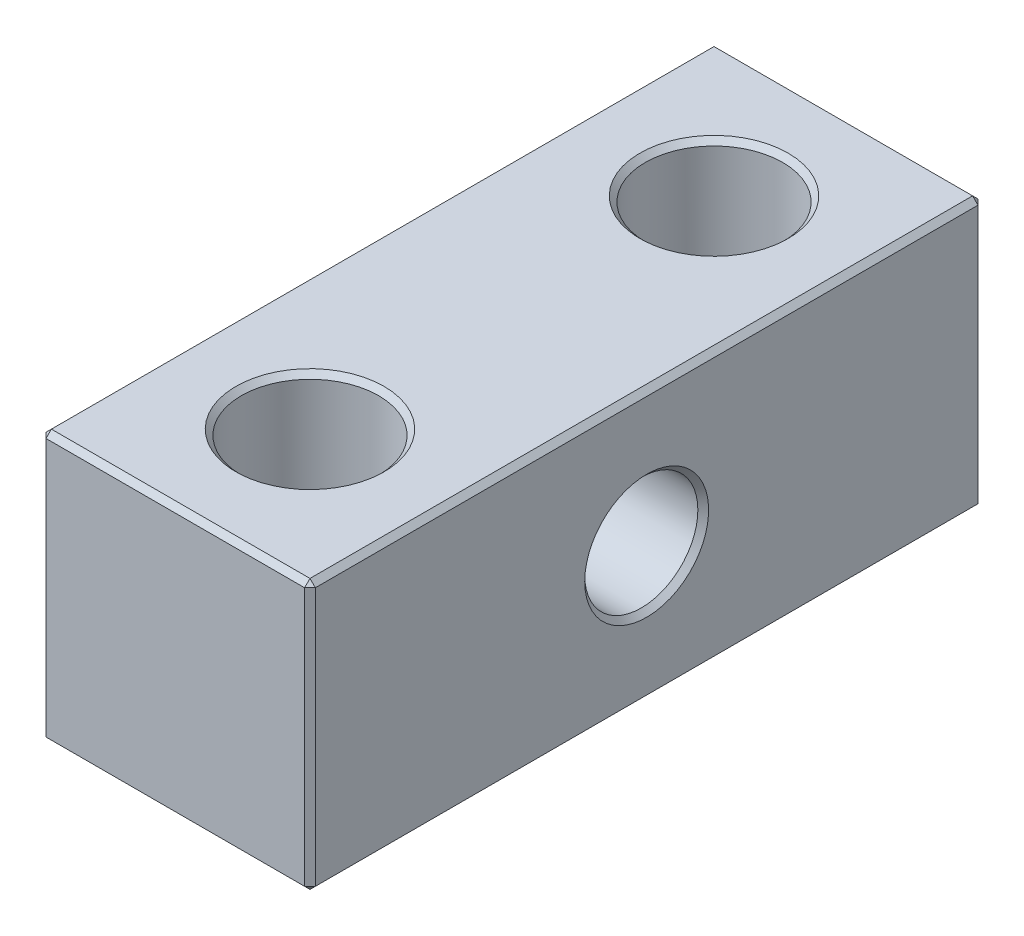
ISO-10303-21;
HEADER;
FILE_DESCRIPTION(('STEP AP214'),'2;1');
FILE_NAME('part.step','',(''),(''),'','','');
FILE_SCHEMA(('AUTOMOTIVE_DESIGN { 1 0 10303 214 1 1 1 1 }'));
ENDSEC;
DATA;
#1=APPLICATION_CONTEXT('core data for automotive mechanical design processes');
#2=APPLICATION_PROTOCOL_DEFINITION('international standard','automotive_design',2000,#1);
#3=PRODUCT_CONTEXT('',#1,'mechanical');
#4=PRODUCT('Part','Part','',(#3));
#5=PRODUCT_RELATED_PRODUCT_CATEGORY('part','',(#4));
#6=PRODUCT_DEFINITION_FORMATION('','',#4);
#7=PRODUCT_DEFINITION_CONTEXT('part definition',#1,'design');
#8=PRODUCT_DEFINITION('design','',#6,#7);
#9=PRODUCT_DEFINITION_SHAPE('','',#8);
#10=(LENGTH_UNIT() NAMED_UNIT(*) SI_UNIT(.MILLI.,.METRE.));
#11=(NAMED_UNIT(*) PLANE_ANGLE_UNIT() SI_UNIT($,.RADIAN.));
#12=(NAMED_UNIT(*) SI_UNIT($,.STERADIAN.) SOLID_ANGLE_UNIT());
#13=UNCERTAINTY_MEASURE_WITH_UNIT(LENGTH_MEASURE(1.E-05),#10,'distance_accuracy_value','');
#14=(GEOMETRIC_REPRESENTATION_CONTEXT(3) GLOBAL_UNCERTAINTY_ASSIGNED_CONTEXT((#13)) GLOBAL_UNIT_ASSIGNED_CONTEXT((#10,
#11,#12)) REPRESENTATION_CONTEXT('',''));
#15=CARTESIAN_POINT('',(0.,0.,0.));
#16=DIRECTION('',(0.,0.,1.));
#17=DIRECTION('',(1.,0.,0.));
#18=AXIS2_PLACEMENT_3D('',#15,#16,#17);
#19=CARTESIAN_POINT('',(5.,5.,12.5));
#20=DIRECTION('',(-1.,0.,0.));
#21=DIRECTION('',(0.,0.,1.));
#22=AXIS2_PLACEMENT_3D('',#19,#20,#21);
#23=PLANE('',#22);
#24=DIRECTION('',(0.,-1.,0.));
#25=VECTOR('',#24,1.);
#26=CARTESIAN_POINT('',(5.,-5.,12.3));
#27=LINE('',#26,#25);
#28=CARTESIAN_POINT('',(5.,4.8,12.3));
#29=VERTEX_POINT('',#28);
#30=CARTESIAN_POINT('',(5.,-4.8,12.3));
#31=VERTEX_POINT('',#30);
#32=EDGE_CURVE('E51',#29,#31,#27,.T.);
#33=ORIENTED_EDGE('',*,*,#32,.T.);
#34=DIRECTION('',(0.,0.,-1.));
#35=VECTOR('',#34,1.);
#36=CARTESIAN_POINT('',(5.,-4.8,12.5));
#37=LINE('',#36,#35);
#38=CARTESIAN_POINT('',(5.,-4.8,-12.3));
#39=VERTEX_POINT('',#38);
#40=EDGE_CURVE('E11',#31,#39,#37,.T.);
#41=ORIENTED_EDGE('',*,*,#40,.T.);
#42=DIRECTION('',(0.,1.,0.));
#43=VECTOR('',#42,1.);
#44=CARTESIAN_POINT('',(5.,5.,-12.3));
#45=LINE('',#44,#43);
#46=CARTESIAN_POINT('',(5.,4.8,-12.3));
#47=VERTEX_POINT('',#46);
#48=EDGE_CURVE('E244',#39,#47,#45,.T.);
#49=ORIENTED_EDGE('',*,*,#48,.T.);
#50=DIRECTION('',(0.,0.,1.));
#51=VECTOR('',#50,1.);
#52=CARTESIAN_POINT('',(5.,4.8,12.5));
#53=LINE('',#52,#51);
#54=EDGE_CURVE('E62',#47,#29,#53,.T.);
#55=ORIENTED_EDGE('',*,*,#54,.T.);
#56=EDGE_LOOP('',(#33,#41,#49,#55));
#57=FACE_BOUND('',#56,.T.);
#58=CARTESIAN_POINT('',(5.,0.,0.));
#59=DIRECTION('',(-1.,0.,0.));
#60=DIRECTION('',(0.,0.,1.));
#61=AXIS2_PLACEMENT_3D('',#58,#59,#60);
#62=CIRCLE('',#61,2.3);
#63=CARTESIAN_POINT('',(5.,0.,2.3));
#64=VERTEX_POINT('',#63);
#65=EDGE_CURVE('E241',#64,#64,#62,.T.);
#66=ORIENTED_EDGE('',*,*,#65,.T.);
#67=EDGE_LOOP('',(#66));
#68=FACE_BOUND('',#67,.T.);
#69=ADVANCED_FACE('F41',(#57,#68),#23,.F.);
#70=CARTESIAN_POINT('',(-5.,5.,12.5));
#71=DIRECTION('',(0.,-1.,0.));
#72=DIRECTION('',(0.,0.,-1.));
#73=AXIS2_PLACEMENT_3D('',#70,#71,#72);
#74=PLANE('',#73);
#75=CARTESIAN_POINT('',(0.,5.,-7.5));
#76=DIRECTION('',(0.,-1.,0.));
#77=DIRECTION('',(0.,0.,-1.));
#78=AXIS2_PLACEMENT_3D('',#75,#76,#77);
#79=CIRCLE('',#78,2.75);
#80=CARTESIAN_POINT('',(0.,5.,-10.25));
#81=VERTEX_POINT('',#80);
#82=EDGE_CURVE('E222',#81,#81,#79,.T.);
#83=ORIENTED_EDGE('',*,*,#82,.T.);
#84=EDGE_LOOP('',(#83));
#85=FACE_BOUND('',#84,.T.);
#86=CARTESIAN_POINT('',(0.,5.,7.5));
#87=DIRECTION('',(0.,-1.,0.));
#88=DIRECTION('',(0.,0.,-1.));
#89=AXIS2_PLACEMENT_3D('',#86,#87,#88);
#90=CIRCLE('',#89,2.75);
#91=CARTESIAN_POINT('',(0.,5.,4.75));
#92=VERTEX_POINT('',#91);
#93=EDGE_CURVE('E219',#92,#92,#90,.T.);
#94=ORIENTED_EDGE('',*,*,#93,.T.);
#95=EDGE_LOOP('',(#94));
#96=FACE_BOUND('',#95,.T.);
#97=DIRECTION('',(0.,0.,1.));
#98=VECTOR('',#97,1.);
#99=CARTESIAN_POINT('',(-4.8,5.,12.5));
#100=LINE('',#99,#98);
#101=CARTESIAN_POINT('',(-4.8,5.,-12.3));
#102=VERTEX_POINT('',#101);
#103=CARTESIAN_POINT('',(-4.8,5.,12.3));
#104=VERTEX_POINT('',#103);
#105=EDGE_CURVE('E214',#102,#104,#100,.T.);
#106=ORIENTED_EDGE('',*,*,#105,.T.);
#107=DIRECTION('',(1.,0.,0.));
#108=VECTOR('',#107,1.);
#109=CARTESIAN_POINT('',(5.,5.,12.3));
#110=LINE('',#109,#108);
#111=CARTESIAN_POINT('',(4.8,5.,12.3));
#112=VERTEX_POINT('',#111);
#113=EDGE_CURVE('E216',#104,#112,#110,.T.);
#114=ORIENTED_EDGE('',*,*,#113,.T.);
#115=DIRECTION('',(0.,0.,-1.));
#116=VECTOR('',#115,1.);
#117=CARTESIAN_POINT('',(4.8,5.,12.5));
#118=LINE('',#117,#116);
#119=CARTESIAN_POINT('',(4.8,5.,-12.3));
#120=VERTEX_POINT('',#119);
#121=EDGE_CURVE('E210',#112,#120,#118,.T.);
#122=ORIENTED_EDGE('',*,*,#121,.T.);
#123=DIRECTION('',(-1.,0.,0.));
#124=VECTOR('',#123,1.);
#125=CARTESIAN_POINT('',(-5.,5.,-12.3));
#126=LINE('',#125,#124);
#127=EDGE_CURVE('E212',#120,#102,#126,.T.);
#128=ORIENTED_EDGE('',*,*,#127,.T.);
#129=EDGE_LOOP('',(#106,#114,#122,#128));
#130=FACE_BOUND('',#129,.T.);
#131=ADVANCED_FACE('F344',(#85,#96,#130),#74,.F.);
#132=CARTESIAN_POINT('',(-5.,5.,12.5));
#133=DIRECTION('',(1.,0.,0.));
#134=DIRECTION('',(0.,1.,0.));
#135=AXIS2_PLACEMENT_3D('',#132,#133,#134);
#136=PLANE('',#135);
#137=CARTESIAN_POINT('',(-5.,0.,0.));
#138=DIRECTION('',(1.,0.,0.));
#139=DIRECTION('',(0.,1.,0.));
#140=AXIS2_PLACEMENT_3D('',#137,#138,#139);
#141=CIRCLE('',#140,2.29999999999999);
#142=CARTESIAN_POINT('',(-5.,2.29999999999999,0.));
#143=VERTEX_POINT('',#142);
#144=EDGE_CURVE('E201',#143,#143,#141,.T.);
#145=ORIENTED_EDGE('',*,*,#144,.T.);
#146=EDGE_LOOP('',(#145));
#147=FACE_BOUND('',#146,.T.);
#148=DIRECTION('',(0.,0.,1.));
#149=VECTOR('',#148,1.);
#150=CARTESIAN_POINT('',(-5.,-4.8,12.5));
#151=LINE('',#150,#149);
#152=CARTESIAN_POINT('',(-5.,-4.8,-12.3));
#153=VERTEX_POINT('',#152);
#154=CARTESIAN_POINT('',(-5.,-4.8,12.3));
#155=VERTEX_POINT('',#154);
#156=EDGE_CURVE('E196',#153,#155,#151,.T.);
#157=ORIENTED_EDGE('',*,*,#156,.T.);
#158=DIRECTION('',(0.,1.,0.));
#159=VECTOR('',#158,1.);
#160=CARTESIAN_POINT('',(-5.,5.,12.3));
#161=LINE('',#160,#159);
#162=CARTESIAN_POINT('',(-5.,4.8,12.3));
#163=VERTEX_POINT('',#162);
#164=EDGE_CURVE('E198',#155,#163,#161,.T.);
#165=ORIENTED_EDGE('',*,*,#164,.T.);
#166=DIRECTION('',(0.,0.,-1.));
#167=VECTOR('',#166,1.);
#168=CARTESIAN_POINT('',(-5.,4.8,12.5));
#169=LINE('',#168,#167);
#170=CARTESIAN_POINT('',(-5.,4.8,-12.3));
#171=VERTEX_POINT('',#170);
#172=EDGE_CURVE('E192',#163,#171,#169,.T.);
#173=ORIENTED_EDGE('',*,*,#172,.T.);
#174=DIRECTION('',(0.,-1.,0.));
#175=VECTOR('',#174,1.);
#176=CARTESIAN_POINT('',(-5.,5.,-12.3));
#177=LINE('',#176,#175);
#178=EDGE_CURVE('E194',#171,#153,#177,.T.);
#179=ORIENTED_EDGE('',*,*,#178,.T.);
#180=EDGE_LOOP('',(#157,#165,#173,#179));
#181=FACE_BOUND('',#180,.T.);
#182=ADVANCED_FACE('F373',(#147,#181),#136,.F.);
#183=CARTESIAN_POINT('',(-5.,-5.,12.5));
#184=DIRECTION('',(0.,1.,0.));
#185=DIRECTION('',(0.,0.,1.));
#186=AXIS2_PLACEMENT_3D('',#183,#184,#185);
#187=PLANE('',#186);
#188=CARTESIAN_POINT('',(0.,-5.,-7.5));
#189=DIRECTION('',(0.,1.,0.));
#190=DIRECTION('',(0.,0.,1.));
#191=AXIS2_PLACEMENT_3D('',#188,#189,#190);
#192=CIRCLE('',#191,2.74999999999999);
#193=CARTESIAN_POINT('',(0.,-5.,-4.75000000000001));
#194=VERTEX_POINT('',#193);
#195=EDGE_CURVE('E177',#194,#194,#192,.T.);
#196=ORIENTED_EDGE('',*,*,#195,.T.);
#197=EDGE_LOOP('',(#196));
#198=FACE_BOUND('',#197,.T.);
#199=CARTESIAN_POINT('',(0.,-5.,7.5));
#200=DIRECTION('',(0.,1.,0.));
#201=DIRECTION('',(0.,0.,1.));
#202=AXIS2_PLACEMENT_3D('',#199,#200,#201);
#203=CIRCLE('',#202,2.75);
#204=CARTESIAN_POINT('',(0.,-5.,10.25));
#205=VERTEX_POINT('',#204);
#206=EDGE_CURVE('E174',#205,#205,#203,.T.);
#207=ORIENTED_EDGE('',*,*,#206,.T.);
#208=EDGE_LOOP('',(#207));
#209=FACE_BOUND('',#208,.T.);
#210=DIRECTION('',(-1.,0.,0.));
#211=VECTOR('',#210,1.);
#212=CARTESIAN_POINT('',(-5.,-5.,12.3));
#213=LINE('',#212,#211);
#214=CARTESIAN_POINT('',(4.8,-5.,12.3));
#215=VERTEX_POINT('',#214);
#216=CARTESIAN_POINT('',(-4.8,-5.,12.3));
#217=VERTEX_POINT('',#216);
#218=EDGE_CURVE('E142',#215,#217,#213,.T.);
#219=ORIENTED_EDGE('',*,*,#218,.T.);
#220=DIRECTION('',(0.,0.,-1.));
#221=VECTOR('',#220,1.);
#222=CARTESIAN_POINT('',(-4.8,-5.,12.5));
#223=LINE('',#222,#221);
#224=CARTESIAN_POINT('',(-4.8,-5.,-12.3));
#225=VERTEX_POINT('',#224);
#226=EDGE_CURVE('E138',#217,#225,#223,.T.);
#227=ORIENTED_EDGE('',*,*,#226,.T.);
#228=DIRECTION('',(1.,0.,0.));
#229=VECTOR('',#228,1.);
#230=CARTESIAN_POINT('',(-5.,-5.,-12.3));
#231=LINE('',#230,#229);
#232=CARTESIAN_POINT('',(4.8,-5.,-12.3));
#233=VERTEX_POINT('',#232);
#234=EDGE_CURVE('E130',#225,#233,#231,.T.);
#235=ORIENTED_EDGE('',*,*,#234,.T.);
#236=DIRECTION('',(0.,0.,1.));
#237=VECTOR('',#236,1.);
#238=CARTESIAN_POINT('',(4.8,-5.,12.5));
#239=LINE('',#238,#237);
#240=EDGE_CURVE('E135',#233,#215,#239,.T.);
#241=ORIENTED_EDGE('',*,*,#240,.T.);
#242=EDGE_LOOP('',(#219,#227,#235,#241));
#243=FACE_BOUND('',#242,.T.);
#244=ADVANCED_FACE('F133',(#198,#209,#243),#187,.F.);
#245=CARTESIAN_POINT('',(0.,0.,12.5));
#246=DIRECTION('',(0.,0.,1.));
#247=DIRECTION('',(1.,0.,0.));
#248=AXIS2_PLACEMENT_3D('',#245,#246,#247);
#249=PLANE('',#248);
#250=DIRECTION('',(0.,-1.,0.));
#251=VECTOR('',#250,1.);
#252=CARTESIAN_POINT('',(-4.8,-5.,12.5));
#253=LINE('',#252,#251);
#254=CARTESIAN_POINT('',(-4.8,4.8,12.5));
#255=VERTEX_POINT('',#254);
#256=CARTESIAN_POINT('',(-4.8,-4.8,12.5));
#257=VERTEX_POINT('',#256);
#258=EDGE_CURVE('E229',#255,#257,#253,.T.);
#259=ORIENTED_EDGE('',*,*,#258,.T.);
#260=DIRECTION('',(1.,0.,0.));
#261=VECTOR('',#260,1.);
#262=CARTESIAN_POINT('',(5.,-4.8,12.5));
#263=LINE('',#262,#261);
#264=CARTESIAN_POINT('',(4.8,-4.8,12.5));
#265=VERTEX_POINT('',#264);
#266=EDGE_CURVE('E231',#257,#265,#263,.T.);
#267=ORIENTED_EDGE('',*,*,#266,.T.);
#268=DIRECTION('',(0.,1.,0.));
#269=VECTOR('',#268,1.);
#270=CARTESIAN_POINT('',(4.8,5.,12.5));
#271=LINE('',#270,#269);
#272=CARTESIAN_POINT('',(4.8,4.8,12.5));
#273=VERTEX_POINT('',#272);
#274=EDGE_CURVE('E225',#265,#273,#271,.T.);
#275=ORIENTED_EDGE('',*,*,#274,.T.);
#276=DIRECTION('',(-1.,0.,0.));
#277=VECTOR('',#276,1.);
#278=CARTESIAN_POINT('',(-5.,4.8,12.5));
#279=LINE('',#278,#277);
#280=EDGE_CURVE('E227',#273,#255,#279,.T.);
#281=ORIENTED_EDGE('',*,*,#280,.T.);
#282=EDGE_LOOP('',(#259,#267,#275,#281));
#283=FACE_BOUND('',#282,.T.);
#284=ADVANCED_FACE('F364',(#283),#249,.T.);
#285=CARTESIAN_POINT('',(0.,0.,-12.5));
#286=DIRECTION('',(0.,0.,1.));
#287=DIRECTION('',(1.,0.,0.));
#288=AXIS2_PLACEMENT_3D('',#285,#286,#287);
#289=PLANE('',#288);
#290=DIRECTION('',(0.,-1.,0.));
#291=VECTOR('',#290,1.);
#292=CARTESIAN_POINT('',(4.8,0.,-12.5));
#293=LINE('',#292,#291);
#294=CARTESIAN_POINT('',(4.8,4.8,-12.5));
#295=VERTEX_POINT('',#294);
#296=CARTESIAN_POINT('',(4.8,-4.8,-12.5));
#297=VERTEX_POINT('',#296);
#298=EDGE_CURVE('E234',#295,#297,#293,.T.);
#299=ORIENTED_EDGE('',*,*,#298,.T.);
#300=DIRECTION('',(-1.,0.,0.));
#301=VECTOR('',#300,1.);
#302=CARTESIAN_POINT('',(0.,-4.8,-12.5));
#303=LINE('',#302,#301);
#304=CARTESIAN_POINT('',(-4.8,-4.8,-12.5));
#305=VERTEX_POINT('',#304);
#306=EDGE_CURVE('E150',#297,#305,#303,.T.);
#307=ORIENTED_EDGE('',*,*,#306,.T.);
#308=DIRECTION('',(0.,1.,0.));
#309=VECTOR('',#308,1.);
#310=CARTESIAN_POINT('',(-4.8,0.,-12.5));
#311=LINE('',#310,#309);
#312=CARTESIAN_POINT('',(-4.8,4.8,-12.5));
#313=VERTEX_POINT('',#312);
#314=EDGE_CURVE('E238',#305,#313,#311,.T.);
#315=ORIENTED_EDGE('',*,*,#314,.T.);
#316=DIRECTION('',(1.,0.,0.));
#317=VECTOR('',#316,1.);
#318=CARTESIAN_POINT('',(0.,4.8,-12.5));
#319=LINE('',#318,#317);
#320=EDGE_CURVE('E236',#313,#295,#319,.T.);
#321=ORIENTED_EDGE('',*,*,#320,.T.);
#322=EDGE_LOOP('',(#299,#307,#315,#321));
#323=FACE_BOUND('',#322,.T.);
#324=ADVANCED_FACE('F339',(#323),#289,.F.);
#325=CARTESIAN_POINT('',(5.,0.,0.));
#326=DIRECTION('',(1.,0.,0.));
#327=DIRECTION('',(0.,0.,-1.));
#328=AXIS2_PLACEMENT_3D('',#325,#326,#327);
#329=CYLINDRICAL_SURFACE('',#328,2.1);
#330=CARTESIAN_POINT('',(-4.8,0.,0.));
#331=DIRECTION('',(1.,0.,0.));
#332=DIRECTION('',(0.,0.,-1.));
#333=AXIS2_PLACEMENT_3D('',#330,#331,#332);
#334=CIRCLE('',#333,2.1);
#335=CARTESIAN_POINT('',(-4.8,0.,-2.1));
#336=VERTEX_POINT('',#335);
#337=EDGE_CURVE('E207',#336,#336,#334,.F.);
#338=ORIENTED_EDGE('',*,*,#337,.T.);
#339=EDGE_LOOP('',(#338));
#340=FACE_BOUND('',#339,.T.);
#341=CARTESIAN_POINT('',(4.8,0.,0.));
#342=DIRECTION('',(-1.,0.,0.));
#343=DIRECTION('',(0.,0.,1.));
#344=AXIS2_PLACEMENT_3D('',#341,#342,#343);
#345=CIRCLE('',#344,2.1);
#346=CARTESIAN_POINT('',(4.8,0.,2.1));
#347=VERTEX_POINT('',#346);
#348=EDGE_CURVE('E204',#347,#347,#345,.F.);
#349=ORIENTED_EDGE('',*,*,#348,.T.);
#350=EDGE_LOOP('',(#349));
#351=FACE_BOUND('',#350,.T.);
#352=ADVANCED_FACE('F352',(#340,#351),#329,.F.);
#353=CARTESIAN_POINT('',(0.,5.,-7.5));
#354=DIRECTION('',(0.,1.,0.));
#355=DIRECTION('',(0.,0.,1.));
#356=AXIS2_PLACEMENT_3D('',#353,#354,#355);
#357=CYLINDRICAL_SURFACE('',#356,2.55);
#358=CARTESIAN_POINT('',(0.,-4.8,-7.5));
#359=DIRECTION('',(0.,1.,0.));
#360=DIRECTION('',(0.,0.,1.));
#361=AXIS2_PLACEMENT_3D('',#358,#359,#360);
#362=CIRCLE('',#361,2.55);
#363=CARTESIAN_POINT('',(0.,-4.8,-4.95));
#364=VERTEX_POINT('',#363);
#365=EDGE_CURVE('E183',#364,#364,#362,.F.);
#366=ORIENTED_EDGE('',*,*,#365,.T.);
#367=EDGE_LOOP('',(#366));
#368=FACE_BOUND('',#367,.T.);
#369=CARTESIAN_POINT('',(0.,4.8,-7.5));
#370=DIRECTION('',(0.,-1.,0.));
#371=DIRECTION('',(0.,0.,-1.));
#372=AXIS2_PLACEMENT_3D('',#369,#370,#371);
#373=CIRCLE('',#372,2.55);
#374=CARTESIAN_POINT('',(0.,4.8,-10.05));
#375=VERTEX_POINT('',#374);
#376=EDGE_CURVE('E180',#375,#375,#373,.F.);
#377=ORIENTED_EDGE('',*,*,#376,.T.);
#378=EDGE_LOOP('',(#377));
#379=FACE_BOUND('',#378,.T.);
#380=ADVANCED_FACE('F354',(#368,#379),#357,.F.);
#381=CARTESIAN_POINT('',(0.,5.,7.5));
#382=DIRECTION('',(0.,1.,0.));
#383=DIRECTION('',(0.,0.,1.));
#384=AXIS2_PLACEMENT_3D('',#381,#382,#383);
#385=CYLINDRICAL_SURFACE('',#384,2.55);
#386=CARTESIAN_POINT('',(0.,-4.8,7.5));
#387=DIRECTION('',(0.,1.,0.));
#388=DIRECTION('',(0.,0.,1.));
#389=AXIS2_PLACEMENT_3D('',#386,#387,#388);
#390=CIRCLE('',#389,2.55);
#391=CARTESIAN_POINT('',(0.,-4.8,10.05));
#392=VERTEX_POINT('',#391);
#393=EDGE_CURVE('E189',#392,#392,#390,.F.);
#394=ORIENTED_EDGE('',*,*,#393,.T.);
#395=EDGE_LOOP('',(#394));
#396=FACE_BOUND('',#395,.T.);
#397=CARTESIAN_POINT('',(0.,4.8,7.5));
#398=DIRECTION('',(0.,-1.,0.));
#399=DIRECTION('',(0.,0.,-1.));
#400=AXIS2_PLACEMENT_3D('',#397,#398,#399);
#401=CIRCLE('',#400,2.55);
#402=CARTESIAN_POINT('',(0.,4.8,4.95));
#403=VERTEX_POINT('',#402);
#404=EDGE_CURVE('E186',#403,#403,#401,.F.);
#405=ORIENTED_EDGE('',*,*,#404,.T.);
#406=EDGE_LOOP('',(#405));
#407=FACE_BOUND('',#406,.T.);
#408=ADVANCED_FACE('F361',(#396,#407),#385,.F.);
#409=CARTESIAN_POINT('',(0.,-5.,-7.5));
#410=DIRECTION('',(0.,-1.,0.));
#411=DIRECTION('',(0.,0.,-1.));
#412=AXIS2_PLACEMENT_3D('',#409,#410,#411);
#413=CONICAL_SURFACE('',#412,2.74999999999999,0.785398163397444);
#414=ORIENTED_EDGE('',*,*,#365,.F.);
#415=EDGE_LOOP('',(#414));
#416=FACE_BOUND('',#415,.T.);
#417=ORIENTED_EDGE('',*,*,#195,.F.);
#418=EDGE_LOOP('',(#417));
#419=FACE_BOUND('',#418,.T.);
#420=ADVANCED_FACE('F382',(#416,#419),#413,.F.);
#421=CARTESIAN_POINT('',(0.,-5.,7.5));
#422=DIRECTION('',(0.,-1.,0.));
#423=DIRECTION('',(0.,0.,-1.));
#424=AXIS2_PLACEMENT_3D('',#421,#422,#423);
#425=CONICAL_SURFACE('',#424,2.75,0.785398163397448);
#426=ORIENTED_EDGE('',*,*,#393,.F.);
#427=EDGE_LOOP('',(#426));
#428=FACE_BOUND('',#427,.T.);
#429=ORIENTED_EDGE('',*,*,#206,.F.);
#430=EDGE_LOOP('',(#429));
#431=FACE_BOUND('',#430,.T.);
#432=ADVANCED_FACE('F388',(#428,#431),#425,.F.);
#433=CARTESIAN_POINT('',(-5.,0.,0.));
#434=DIRECTION('',(-1.,0.,0.));
#435=DIRECTION('',(0.,0.,1.));
#436=AXIS2_PLACEMENT_3D('',#433,#434,#435);
#437=CONICAL_SURFACE('',#436,2.29999999999999,0.785398163397444);
#438=ORIENTED_EDGE('',*,*,#337,.F.);
#439=EDGE_LOOP('',(#438));
#440=FACE_BOUND('',#439,.T.);
#441=ORIENTED_EDGE('',*,*,#144,.F.);
#442=EDGE_LOOP('',(#441));
#443=FACE_BOUND('',#442,.T.);
#444=ADVANCED_FACE('F395',(#440,#443),#437,.F.);
#445=CARTESIAN_POINT('',(0.,4.8,-7.5));
#446=DIRECTION('',(0.,1.,0.));
#447=DIRECTION('',(0.,0.,1.));
#448=AXIS2_PLACEMENT_3D('',#445,#446,#447);
#449=CONICAL_SURFACE('',#448,2.55,0.785398163397457);
#450=ORIENTED_EDGE('',*,*,#82,.F.);
#451=EDGE_LOOP('',(#450));
#452=FACE_BOUND('',#451,.T.);
#453=ORIENTED_EDGE('',*,*,#376,.F.);
#454=EDGE_LOOP('',(#453));
#455=FACE_BOUND('',#454,.T.);
#456=ADVANCED_FACE('F402',(#452,#455),#449,.F.);
#457=CARTESIAN_POINT('',(0.,4.8,7.5));
#458=DIRECTION('',(0.,1.,0.));
#459=DIRECTION('',(0.,0.,1.));
#460=AXIS2_PLACEMENT_3D('',#457,#458,#459);
#461=CONICAL_SURFACE('',#460,2.55,0.785398163397457);
#462=ORIENTED_EDGE('',*,*,#93,.F.);
#463=EDGE_LOOP('',(#462));
#464=FACE_BOUND('',#463,.T.);
#465=ORIENTED_EDGE('',*,*,#404,.F.);
#466=EDGE_LOOP('',(#465));
#467=FACE_BOUND('',#466,.T.);
#468=ADVANCED_FACE('F409',(#464,#467),#461,.F.);
#469=CARTESIAN_POINT('',(-5.,5.,-12.3));
#470=DIRECTION('',(0.,-0.707106781186547,0.707106781186547));
#471=DIRECTION('',(-1.,0.,0.));
#472=AXIS2_PLACEMENT_3D('',#469,#470,#471);
#473=PLANE('',#472);
#474=DIRECTION('',(0.,0.707106781186547,0.707106781186547));
#475=VECTOR('',#474,1.);
#476=CARTESIAN_POINT('',(-4.8,4.8,-12.5));
#477=LINE('',#476,#475);
#478=EDGE_CURVE('E46',#102,#313,#477,.F.);
#479=ORIENTED_EDGE('',*,*,#478,.F.);
#480=ORIENTED_EDGE('',*,*,#127,.F.);
#481=DIRECTION('',(0.,-0.707106781186547,-0.707106781186547));
#482=VECTOR('',#481,1.);
#483=CARTESIAN_POINT('',(4.8,4.8,-12.5));
#484=LINE('',#483,#482);
#485=EDGE_CURVE('E170',#295,#120,#484,.F.);
#486=ORIENTED_EDGE('',*,*,#485,.F.);
#487=ORIENTED_EDGE('',*,*,#320,.F.);
#488=EDGE_LOOP('',(#479,#480,#486,#487));
#489=FACE_BOUND('',#488,.T.);
#490=ADVANCED_FACE('F416',(#489),#473,.F.);
#491=CARTESIAN_POINT('',(-4.8,4.8,-12.5));
#492=DIRECTION('',(-0.577350269189626,0.577350269189626,-0.577350269189626));
#493=DIRECTION('',(-0.707106781186547,0.,0.707106781186547));
#494=AXIS2_PLACEMENT_3D('',#491,#492,#493);
#495=PLANE('',#494);
#496=DIRECTION('',(-0.707106781186547,-0.707106781186547,0.));
#497=VECTOR('',#496,1.);
#498=CARTESIAN_POINT('',(-4.9,4.9,-12.3));
#499=LINE('',#498,#497);
#500=EDGE_CURVE('E289',#102,#171,#499,.T.);
#501=ORIENTED_EDGE('',*,*,#500,.F.);
#502=ORIENTED_EDGE('',*,*,#478,.T.);
#503=DIRECTION('',(0.707106781186548,0.,-0.707106781186548));
#504=VECTOR('',#503,1.);
#505=CARTESIAN_POINT('',(-4.8,4.8,-12.5));
#506=LINE('',#505,#504);
#507=EDGE_CURVE('E292',#171,#313,#506,.T.);
#508=ORIENTED_EDGE('',*,*,#507,.F.);
#509=EDGE_LOOP('',(#501,#502,#508));
#510=FACE_BOUND('',#509,.T.);
#511=ADVANCED_FACE('F517',(#510),#495,.T.);
#512=CARTESIAN_POINT('',(4.8,4.8,-12.5));
#513=DIRECTION('',(0.577350269189626,0.577350269189626,-0.577350269189626));
#514=DIRECTION('',(-0.707106781186547,0.,-0.707106781186547));
#515=AXIS2_PLACEMENT_3D('',#512,#513,#514);
#516=PLANE('',#515);
#517=DIRECTION('',(0.707106781186547,0.,0.707106781186547));
#518=VECTOR('',#517,1.);
#519=CARTESIAN_POINT('',(4.8,4.8,-12.5));
#520=LINE('',#519,#518);
#521=EDGE_CURVE('E283',#295,#47,#520,.T.);
#522=ORIENTED_EDGE('',*,*,#521,.F.);
#523=ORIENTED_EDGE('',*,*,#485,.T.);
#524=DIRECTION('',(-0.707106781186547,0.707106781186547,0.));
#525=VECTOR('',#524,1.);
#526=CARTESIAN_POINT('',(4.9,4.9,-12.3));
#527=LINE('',#526,#525);
#528=EDGE_CURVE('E286',#47,#120,#527,.T.);
#529=ORIENTED_EDGE('',*,*,#528,.F.);
#530=EDGE_LOOP('',(#522,#523,#529));
#531=FACE_BOUND('',#530,.T.);
#532=ADVANCED_FACE('F299',(#531),#516,.T.);
#533=CARTESIAN_POINT('',(-5.,5.,-12.3));
#534=DIRECTION('',(0.707106781186547,0.,0.707106781186547));
#535=DIRECTION('',(0.,-1.,0.));
#536=AXIS2_PLACEMENT_3D('',#533,#534,#535);
#537=PLANE('',#536);
#538=ORIENTED_EDGE('',*,*,#507,.T.);
#539=ORIENTED_EDGE('',*,*,#314,.F.);
#540=DIRECTION('',(-0.707106781186547,0.,0.707106781186547));
#541=VECTOR('',#540,1.);
#542=CARTESIAN_POINT('',(-4.8,-4.8,-12.5));
#543=LINE('',#542,#541);
#544=EDGE_CURVE('E279',#153,#305,#543,.F.);
#545=ORIENTED_EDGE('',*,*,#544,.F.);
#546=ORIENTED_EDGE('',*,*,#178,.F.);
#547=EDGE_LOOP('',(#538,#539,#545,#546));
#548=FACE_BOUND('',#547,.T.);
#549=ADVANCED_FACE('F335',(#548),#537,.F.);
#550=CARTESIAN_POINT('',(-5.,4.8,12.5));
#551=DIRECTION('',(0.707106781186547,-0.707106781186547,0.));
#552=DIRECTION('',(0.,0.,-1.));
#553=AXIS2_PLACEMENT_3D('',#550,#551,#552);
#554=PLANE('',#553);
#555=ORIENTED_EDGE('',*,*,#500,.T.);
#556=ORIENTED_EDGE('',*,*,#172,.F.);
#557=DIRECTION('',(0.707106781186547,0.707106781186547,0.));
#558=VECTOR('',#557,1.);
#559=CARTESIAN_POINT('',(-5.,4.8,12.3));
#560=LINE('',#559,#558);
#561=EDGE_CURVE('E276',#104,#163,#560,.F.);
#562=ORIENTED_EDGE('',*,*,#561,.F.);
#563=ORIENTED_EDGE('',*,*,#105,.F.);
#564=EDGE_LOOP('',(#555,#556,#562,#563));
#565=FACE_BOUND('',#564,.T.);
#566=ADVANCED_FACE('F499',(#565),#554,.F.);
#567=CARTESIAN_POINT('',(0.,4.8,12.5));
#568=DIRECTION('',(0.,0.707106781186547,0.707106781186547));
#569=DIRECTION('',(1.,0.,0.));
#570=AXIS2_PLACEMENT_3D('',#567,#568,#569);
#571=PLANE('',#570);
#572=DIRECTION('',(0.,-0.707106781186547,0.707106781186547));
#573=VECTOR('',#572,1.);
#574=CARTESIAN_POINT('',(4.8,5.,12.3));
#575=LINE('',#574,#573);
#576=EDGE_CURVE('E270',#112,#273,#575,.T.);
#577=ORIENTED_EDGE('',*,*,#576,.F.);
#578=ORIENTED_EDGE('',*,*,#113,.F.);
#579=DIRECTION('',(0.,0.707106781186547,-0.707106781186547));
#580=VECTOR('',#579,1.);
#581=CARTESIAN_POINT('',(-4.8,4.9,12.4));
#582=LINE('',#581,#580);
#583=EDGE_CURVE('E273',#255,#104,#582,.T.);
#584=ORIENTED_EDGE('',*,*,#583,.F.);
#585=ORIENTED_EDGE('',*,*,#280,.F.);
#586=EDGE_LOOP('',(#577,#578,#584,#585));
#587=FACE_BOUND('',#586,.T.);
#588=ADVANCED_FACE('F493',(#587),#571,.T.);
#589=CARTESIAN_POINT('',(4.8,5.,12.5));
#590=DIRECTION('',(-0.707106781186547,-0.707106781186547,0.));
#591=DIRECTION('',(0.,0.,-1.));
#592=AXIS2_PLACEMENT_3D('',#589,#590,#591);
#593=PLANE('',#592);
#594=ORIENTED_EDGE('',*,*,#528,.T.);
#595=ORIENTED_EDGE('',*,*,#121,.F.);
#596=DIRECTION('',(0.707106781186547,-0.707106781186547,0.));
#597=VECTOR('',#596,1.);
#598=CARTESIAN_POINT('',(4.8,5.,12.3));
#599=LINE('',#598,#597);
#600=EDGE_CURVE('E268',#29,#112,#599,.F.);
#601=ORIENTED_EDGE('',*,*,#600,.F.);
#602=ORIENTED_EDGE('',*,*,#54,.F.);
#603=EDGE_LOOP('',(#594,#595,#601,#602));
#604=FACE_BOUND('',#603,.T.);
#605=ADVANCED_FACE('F306',(#604),#593,.F.);
#606=CARTESIAN_POINT('',(5.,5.,-12.3));
#607=DIRECTION('',(-0.707106781186547,0.,0.707106781186547));
#608=DIRECTION('',(0.,1.,0.));
#609=AXIS2_PLACEMENT_3D('',#606,#607,#608);
#610=PLANE('',#609);
#611=ORIENTED_EDGE('',*,*,#521,.T.);
#612=ORIENTED_EDGE('',*,*,#48,.F.);
#613=DIRECTION('',(-0.707106781186547,0.,-0.707106781186547));
#614=VECTOR('',#613,1.);
#615=CARTESIAN_POINT('',(4.9,-4.8,-12.4));
#616=LINE('',#615,#614);
#617=EDGE_CURVE('E154',#297,#39,#616,.F.);
#618=ORIENTED_EDGE('',*,*,#617,.F.);
#619=ORIENTED_EDGE('',*,*,#298,.F.);
#620=EDGE_LOOP('',(#611,#612,#618,#619));
#621=FACE_BOUND('',#620,.T.);
#622=ADVANCED_FACE('F341',(#621),#610,.F.);
#623=CARTESIAN_POINT('',(-5.,-5.,-12.3));
#624=DIRECTION('',(0.,0.707106781186547,0.707106781186547));
#625=DIRECTION('',(1.,0.,0.));
#626=AXIS2_PLACEMENT_3D('',#623,#624,#625);
#627=PLANE('',#626);
#628=DIRECTION('',(0.,0.707106781186547,-0.707106781186547));
#629=VECTOR('',#628,1.);
#630=CARTESIAN_POINT('',(-4.8,-4.8,-12.5));
#631=LINE('',#630,#629);
#632=EDGE_CURVE('E281',#305,#225,#631,.F.);
#633=ORIENTED_EDGE('',*,*,#632,.F.);
#634=ORIENTED_EDGE('',*,*,#306,.F.);
#635=DIRECTION('',(0.,-0.707106781186547,0.707106781186547));
#636=VECTOR('',#635,1.);
#637=CARTESIAN_POINT('',(4.8,-5.,-12.3));
#638=LINE('',#637,#636);
#639=EDGE_CURVE('E146',#233,#297,#638,.F.);
#640=ORIENTED_EDGE('',*,*,#639,.F.);
#641=ORIENTED_EDGE('',*,*,#234,.F.);
#642=EDGE_LOOP('',(#633,#634,#640,#641));
#643=FACE_BOUND('',#642,.T.);
#644=ADVANCED_FACE('F148',(#643),#627,.F.);
#645=CARTESIAN_POINT('',(-4.8,-4.8,-12.5));
#646=DIRECTION('',(-0.577350269189626,-0.577350269189626,-0.577350269189626));
#647=DIRECTION('',(-0.707106781186547,0.,0.707106781186547));
#648=AXIS2_PLACEMENT_3D('',#645,#646,#647);
#649=PLANE('',#648);
#650=ORIENTED_EDGE('',*,*,#544,.T.);
#651=ORIENTED_EDGE('',*,*,#632,.T.);
#652=DIRECTION('',(0.707106781186547,-0.707106781186547,0.));
#653=VECTOR('',#652,1.);
#654=CARTESIAN_POINT('',(-4.9,-4.9,-12.3));
#655=LINE('',#654,#653);
#656=EDGE_CURVE('E155',#153,#225,#655,.T.);
#657=ORIENTED_EDGE('',*,*,#656,.F.);
#658=EDGE_LOOP('',(#650,#651,#657));
#659=FACE_BOUND('',#658,.T.);
#660=ADVANCED_FACE('F331',(#659),#649,.T.);
#661=CARTESIAN_POINT('',(-5.,4.8,12.3));
#662=DIRECTION('',(-0.577350269189626,0.577350269189626,0.577350269189626));
#663=DIRECTION('',(0.707106781186547,0.,0.707106781186547));
#664=AXIS2_PLACEMENT_3D('',#661,#662,#663);
#665=PLANE('',#664);
#666=ORIENTED_EDGE('',*,*,#583,.T.);
#667=ORIENTED_EDGE('',*,*,#561,.T.);
#668=DIRECTION('',(0.707106781186548,0.,0.707106781186548));
#669=VECTOR('',#668,1.);
#670=CARTESIAN_POINT('',(-5.,4.8,12.3));
#671=LINE('',#670,#669);
#672=EDGE_CURVE('E263',#255,#163,#671,.F.);
#673=ORIENTED_EDGE('',*,*,#672,.F.);
#674=EDGE_LOOP('',(#666,#667,#673));
#675=FACE_BOUND('',#674,.T.);
#676=ADVANCED_FACE('F466',(#675),#665,.T.);
#677=CARTESIAN_POINT('',(4.8,5.,12.3));
#678=DIRECTION('',(0.577350269189626,0.577350269189626,0.577350269189626));
#679=DIRECTION('',(0.707106781186547,0.,-0.707106781186547));
#680=AXIS2_PLACEMENT_3D('',#677,#678,#679);
#681=PLANE('',#680);
#682=ORIENTED_EDGE('',*,*,#600,.T.);
#683=ORIENTED_EDGE('',*,*,#576,.T.);
#684=DIRECTION('',(0.707106781186547,0.,-0.707106781186547));
#685=VECTOR('',#684,1.);
#686=CARTESIAN_POINT('',(4.9,4.8,12.4));
#687=LINE('',#686,#685);
#688=EDGE_CURVE('E161',#29,#273,#687,.F.);
#689=ORIENTED_EDGE('',*,*,#688,.F.);
#690=EDGE_LOOP('',(#682,#683,#689));
#691=FACE_BOUND('',#690,.T.);
#692=ADVANCED_FACE('F310',(#691),#681,.T.);
#693=CARTESIAN_POINT('',(4.8,-5.,-12.3));
#694=DIRECTION('',(0.577350269189626,-0.577350269189626,-0.577350269189626));
#695=DIRECTION('',(-0.707106781186547,0.,-0.707106781186547));
#696=AXIS2_PLACEMENT_3D('',#693,#694,#695);
#697=PLANE('',#696);
#698=ORIENTED_EDGE('',*,*,#639,.T.);
#699=ORIENTED_EDGE('',*,*,#617,.T.);
#700=DIRECTION('',(0.707106781186547,0.707106781186547,0.));
#701=VECTOR('',#700,1.);
#702=CARTESIAN_POINT('',(4.8,-5.,-12.3));
#703=LINE('',#702,#701);
#704=EDGE_CURVE('E157',#233,#39,#703,.T.);
#705=ORIENTED_EDGE('',*,*,#704,.F.);
#706=EDGE_LOOP('',(#698,#699,#705));
#707=FACE_BOUND('',#706,.T.);
#708=ADVANCED_FACE('F158',(#707),#697,.T.);
#709=CARTESIAN_POINT('',(-4.8,-5.,12.5));
#710=DIRECTION('',(0.707106781186547,0.707106781186547,0.));
#711=DIRECTION('',(0.,0.,-1.));
#712=AXIS2_PLACEMENT_3D('',#709,#710,#711);
#713=PLANE('',#712);
#714=ORIENTED_EDGE('',*,*,#656,.T.);
#715=ORIENTED_EDGE('',*,*,#226,.F.);
#716=DIRECTION('',(-0.707106781186547,0.707106781186547,0.));
#717=VECTOR('',#716,1.);
#718=CARTESIAN_POINT('',(-4.8,-5.,12.3));
#719=LINE('',#718,#717);
#720=EDGE_CURVE('E162',#155,#217,#719,.F.);
#721=ORIENTED_EDGE('',*,*,#720,.F.);
#722=ORIENTED_EDGE('',*,*,#156,.F.);
#723=EDGE_LOOP('',(#714,#715,#721,#722));
#724=FACE_BOUND('',#723,.T.);
#725=ADVANCED_FACE('F328',(#724),#713,.F.);
#726=CARTESIAN_POINT('',(-4.8,0.,12.5));
#727=DIRECTION('',(-0.707106781186547,0.,0.707106781186547));
#728=DIRECTION('',(0.,1.,0.));
#729=AXIS2_PLACEMENT_3D('',#726,#727,#728);
#730=PLANE('',#729);
#731=ORIENTED_EDGE('',*,*,#672,.T.);
#732=ORIENTED_EDGE('',*,*,#164,.F.);
#733=DIRECTION('',(-0.707106781186547,0.,-0.707106781186547));
#734=VECTOR('',#733,1.);
#735=CARTESIAN_POINT('',(-4.9,-4.8,12.4));
#736=LINE('',#735,#734);
#737=EDGE_CURVE('E256',#257,#155,#736,.T.);
#738=ORIENTED_EDGE('',*,*,#737,.F.);
#739=ORIENTED_EDGE('',*,*,#258,.F.);
#740=EDGE_LOOP('',(#731,#732,#738,#739));
#741=FACE_BOUND('',#740,.T.);
#742=ADVANCED_FACE('F444',(#741),#730,.T.);
#743=CARTESIAN_POINT('',(4.8,0.,12.5));
#744=DIRECTION('',(0.707106781186547,0.,0.707106781186547));
#745=DIRECTION('',(0.,-1.,0.));
#746=AXIS2_PLACEMENT_3D('',#743,#744,#745);
#747=PLANE('',#746);
#748=ORIENTED_EDGE('',*,*,#688,.T.);
#749=ORIENTED_EDGE('',*,*,#274,.F.);
#750=DIRECTION('',(-0.707106781186547,0.,0.707106781186547));
#751=VECTOR('',#750,1.);
#752=CARTESIAN_POINT('',(4.8,-4.8,12.5));
#753=LINE('',#752,#751);
#754=EDGE_CURVE('E253',#31,#265,#753,.T.);
#755=ORIENTED_EDGE('',*,*,#754,.F.);
#756=ORIENTED_EDGE('',*,*,#32,.F.);
#757=EDGE_LOOP('',(#748,#749,#755,#756));
#758=FACE_BOUND('',#757,.T.);
#759=ADVANCED_FACE('F314',(#758),#747,.T.);
#760=CARTESIAN_POINT('',(5.,-4.8,12.5));
#761=DIRECTION('',(-0.707106781186547,0.707106781186547,0.));
#762=DIRECTION('',(0.,0.,-1.));
#763=AXIS2_PLACEMENT_3D('',#760,#761,#762);
#764=PLANE('',#763);
#765=ORIENTED_EDGE('',*,*,#704,.T.);
#766=ORIENTED_EDGE('',*,*,#40,.F.);
#767=DIRECTION('',(-0.707106781186547,-0.707106781186547,0.));
#768=VECTOR('',#767,1.);
#769=CARTESIAN_POINT('',(4.9,-4.9,12.3));
#770=LINE('',#769,#768);
#771=EDGE_CURVE('E166',#215,#31,#770,.F.);
#772=ORIENTED_EDGE('',*,*,#771,.F.);
#773=ORIENTED_EDGE('',*,*,#240,.F.);
#774=EDGE_LOOP('',(#765,#766,#772,#773));
#775=FACE_BOUND('',#774,.T.);
#776=ADVANCED_FACE('F164',(#775),#764,.F.);
#777=CARTESIAN_POINT('',(-4.8,-5.,12.3));
#778=DIRECTION('',(-0.577350269189626,-0.577350269189626,0.577350269189626));
#779=DIRECTION('',(0.707106781186547,0.,0.707106781186547));
#780=AXIS2_PLACEMENT_3D('',#777,#778,#779);
#781=PLANE('',#780);
#782=ORIENTED_EDGE('',*,*,#737,.T.);
#783=ORIENTED_EDGE('',*,*,#720,.T.);
#784=DIRECTION('',(0.,0.707106781186547,0.707106781186547));
#785=VECTOR('',#784,1.);
#786=CARTESIAN_POINT('',(-4.8,-5.,12.3));
#787=LINE('',#786,#785);
#788=EDGE_CURVE('E250',#257,#217,#787,.F.);
#789=ORIENTED_EDGE('',*,*,#788,.F.);
#790=EDGE_LOOP('',(#782,#783,#789));
#791=FACE_BOUND('',#790,.T.);
#792=ADVANCED_FACE('F324',(#791),#781,.T.);
#793=CARTESIAN_POINT('',(4.8,-4.8,12.5));
#794=DIRECTION('',(0.577350269189626,-0.577350269189626,0.577350269189626));
#795=DIRECTION('',(0.707106781186547,0.,-0.707106781186547));
#796=AXIS2_PLACEMENT_3D('',#793,#794,#795);
#797=PLANE('',#796);
#798=ORIENTED_EDGE('',*,*,#771,.T.);
#799=ORIENTED_EDGE('',*,*,#754,.T.);
#800=DIRECTION('',(0.,-0.707106781186547,-0.707106781186547));
#801=VECTOR('',#800,1.);
#802=CARTESIAN_POINT('',(4.8,-4.8,12.5));
#803=LINE('',#802,#801);
#804=EDGE_CURVE('E248',#215,#265,#803,.F.);
#805=ORIENTED_EDGE('',*,*,#804,.F.);
#806=EDGE_LOOP('',(#798,#799,#805));
#807=FACE_BOUND('',#806,.T.);
#808=ADVANCED_FACE('F317',(#807),#797,.T.);
#809=CARTESIAN_POINT('',(0.,-4.8,12.5));
#810=DIRECTION('',(0.,-0.707106781186547,0.707106781186547));
#811=DIRECTION('',(-1.,0.,0.));
#812=AXIS2_PLACEMENT_3D('',#809,#810,#811);
#813=PLANE('',#812);
#814=ORIENTED_EDGE('',*,*,#788,.T.);
#815=ORIENTED_EDGE('',*,*,#218,.F.);
#816=ORIENTED_EDGE('',*,*,#804,.T.);
#817=ORIENTED_EDGE('',*,*,#266,.F.);
#818=EDGE_LOOP('',(#814,#815,#816,#817));
#819=FACE_BOUND('',#818,.T.);
#820=ADVANCED_FACE('F320',(#819),#813,.T.);
#821=CARTESIAN_POINT('',(4.8,0.,0.));
#822=DIRECTION('',(1.,0.,0.));
#823=DIRECTION('',(0.,0.,-1.));
#824=AXIS2_PLACEMENT_3D('',#821,#822,#823);
#825=CONICAL_SURFACE('',#824,2.1,0.785398163397455);
#826=ORIENTED_EDGE('',*,*,#65,.F.);
#827=EDGE_LOOP('',(#826));
#828=FACE_BOUND('',#827,.T.);
#829=ORIENTED_EDGE('',*,*,#348,.F.);
#830=EDGE_LOOP('',(#829));
#831=FACE_BOUND('',#830,.T.);
#832=ADVANCED_FACE('F44',(#828,#831),#825,.F.);
#833=CLOSED_SHELL('',(#69,#131,#182,#244,#284,#324,#352,#380,#408,#420,#432,#444,#456,#468,#490,
#511,#532,#549,#566,#588,#605,#622,#644,#660,#676,#692,#708,#725,#742,#759,#776,#792,#808,#820,#832));
#834=MANIFOLD_SOLID_BREP('B2',#833);
#835=ADVANCED_BREP_SHAPE_REPRESENTATION('',(#18,#834),#14);
#836=SHAPE_DEFINITION_REPRESENTATION(#9,#835);
ENDSEC;
END-ISO-10303-21;
